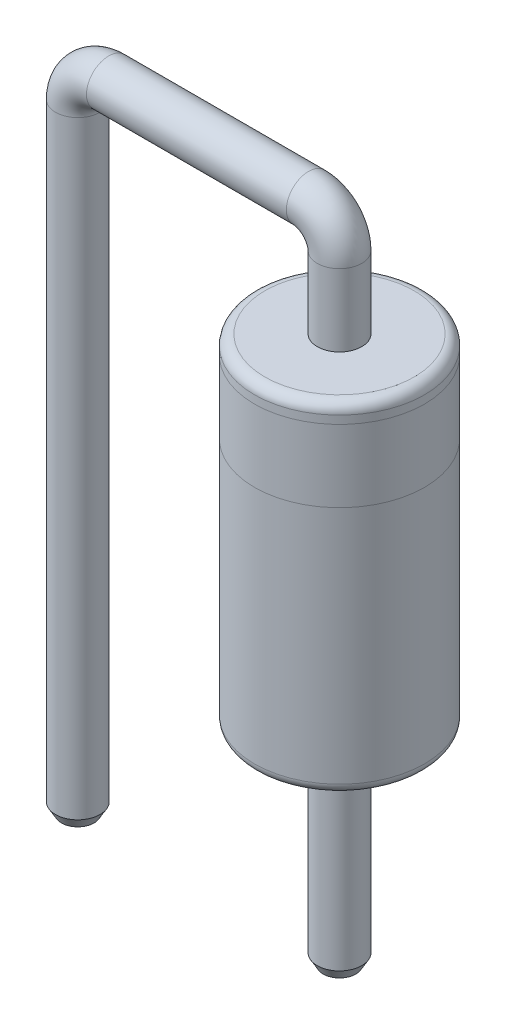
ISO-10303-21;
HEADER;
FILE_DESCRIPTION(('STEP AP214'),'2;1');
FILE_NAME('part.step','',(''),(''),'','','');
FILE_SCHEMA(('AUTOMOTIVE_DESIGN { 1 0 10303 214 1 1 1 1 }'));
ENDSEC;
DATA;
#1=APPLICATION_CONTEXT('core data for automotive mechanical design processes');
#2=APPLICATION_PROTOCOL_DEFINITION('international standard','automotive_design',2000,#1);
#3=PRODUCT_CONTEXT('',#1,'mechanical');
#4=PRODUCT('Part','Part','',(#3));
#5=PRODUCT_RELATED_PRODUCT_CATEGORY('part','',(#4));
#6=PRODUCT_DEFINITION_FORMATION('','',#4);
#7=PRODUCT_DEFINITION_CONTEXT('part definition',#1,'design');
#8=PRODUCT_DEFINITION('design','',#6,#7);
#9=PRODUCT_DEFINITION_SHAPE('','',#8);
#10=(LENGTH_UNIT() NAMED_UNIT(*) SI_UNIT(.MILLI.,.METRE.));
#11=(NAMED_UNIT(*) PLANE_ANGLE_UNIT() SI_UNIT($,.RADIAN.));
#12=(NAMED_UNIT(*) SI_UNIT($,.STERADIAN.) SOLID_ANGLE_UNIT());
#13=UNCERTAINTY_MEASURE_WITH_UNIT(LENGTH_MEASURE(1.E-05),#10,'distance_accuracy_value','');
#14=(GEOMETRIC_REPRESENTATION_CONTEXT(3) GLOBAL_UNCERTAINTY_ASSIGNED_CONTEXT((#13)) GLOBAL_UNIT_ASSIGNED_CONTEXT((#10,
#11,#12)) REPRESENTATION_CONTEXT('',''));
#15=CARTESIAN_POINT('',(0.,0.,0.));
#16=DIRECTION('',(0.,0.,1.));
#17=DIRECTION('',(1.,0.,0.));
#18=AXIS2_PLACEMENT_3D('',#15,#16,#17);
#19=CARTESIAN_POINT('',(0.,5.302,0.));
#20=DIRECTION('',(0.,-1.,0.));
#21=DIRECTION('',(0.,0.,-1.));
#22=AXIS2_PLACEMENT_3D('',#19,#20,#21);
#23=CYLINDRICAL_SURFACE('',#22,0.825);
#24=CARTESIAN_POINT('',(0.,5.202,0.));
#25=DIRECTION('',(0.,1.,0.));
#26=DIRECTION('',(0.,0.,1.));
#27=AXIS2_PLACEMENT_3D('',#24,#25,#26);
#28=CIRCLE('',#27,0.825);
#29=CARTESIAN_POINT('',(0.,5.202,-0.825));
#30=VERTEX_POINT('',#29);
#31=EDGE_CURVE('E67',#30,#30,#28,.F.);
#32=CARTESIAN_POINT('',(0.,5.1241133672325,0.));
#33=DIRECTION('',(0.,-1.,0.));
#34=DIRECTION('',(0.,0.,-1.));
#35=AXIS2_PLACEMENT_3D('',#32,#33,#34);
#36=CIRCLE('',#35,0.825);
#37=CARTESIAN_POINT('',(0.,5.1241133672325,-0.825));
#38=VERTEX_POINT('',#37);
#39=EDGE_CURVE('E10',#38,#38,#36,.T.);
#40=CARTESIAN_POINT('',(0.,5.202,-0.825));
#41=CARTESIAN_POINT('',(0.,5.20118868090867,-0.825));
#42=CARTESIAN_POINT('',(0.,5.20037736181734,-0.825));
#43=CARTESIAN_POINT('',(0.,5.19875472363469,-0.825));
#44=CARTESIAN_POINT('',(0.,5.19794340454336,-0.825));
#45=CARTESIAN_POINT('',(0.,5.1963207663607,-0.825));
#46=CARTESIAN_POINT('',(0.,5.19550944726937,-0.825));
#47=CARTESIAN_POINT('',(0.,5.19388680908672,-0.825));
#48=CARTESIAN_POINT('',(0.,5.19307548999539,-0.825));
#49=CARTESIAN_POINT('',(0.,5.19145285181273,-0.825));
#50=CARTESIAN_POINT('',(0.,5.1906415327214,-0.825));
#51=CARTESIAN_POINT('',(0.,5.18901889453875,-0.825));
#52=CARTESIAN_POINT('',(0.,5.18820757544742,-0.825));
#53=CARTESIAN_POINT('',(0.,5.18658493726476,-0.825));
#54=CARTESIAN_POINT('',(0.,5.18577361817344,-0.825));
#55=CARTESIAN_POINT('',(0.,5.18415097999078,-0.825));
#56=CARTESIAN_POINT('',(0.,5.18333966089945,-0.825));
#57=CARTESIAN_POINT('',(0.,5.1817170227168,-0.825));
#58=CARTESIAN_POINT('',(0.,5.18090570362547,-0.825));
#59=CARTESIAN_POINT('',(0.,5.17928306544281,-0.825));
#60=CARTESIAN_POINT('',(0.,5.17847174635148,-0.825));
#61=CARTESIAN_POINT('',(0.,5.17684910816883,-0.825));
#62=CARTESIAN_POINT('',(0.,5.1760377890775,-0.825));
#63=CARTESIAN_POINT('',(0.,5.17441515089484,-0.825));
#64=CARTESIAN_POINT('',(0.,5.17360383180351,-0.825));
#65=CARTESIAN_POINT('',(0.,5.17198119362086,-0.825));
#66=CARTESIAN_POINT('',(0.,5.17116987452953,-0.825));
#67=CARTESIAN_POINT('',(0.,5.16954723634687,-0.825));
#68=CARTESIAN_POINT('',(0.,5.16873591725554,-0.825));
#69=CARTESIAN_POINT('',(0.,5.16711327907289,-0.825));
#70=CARTESIAN_POINT('',(0.,5.16630195998156,-0.825));
#71=CARTESIAN_POINT('',(0.,5.1646793217989,-0.825));
#72=CARTESIAN_POINT('',(0.,5.16386800270758,-0.825));
#73=CARTESIAN_POINT('',(0.,5.16224536452492,-0.825));
#74=CARTESIAN_POINT('',(0.,5.16143404543359,-0.825));
#75=CARTESIAN_POINT('',(0.,5.15981140725094,-0.825));
#76=CARTESIAN_POINT('',(0.,5.15900008815961,-0.825));
#77=CARTESIAN_POINT('',(0.,5.15737744997695,-0.825));
#78=CARTESIAN_POINT('',(0.,5.15656613088562,-0.825));
#79=CARTESIAN_POINT('',(0.,5.15494349270297,-0.825));
#80=CARTESIAN_POINT('',(0.,5.15413217361164,-0.825));
#81=CARTESIAN_POINT('',(0.,5.15250953542898,-0.825));
#82=CARTESIAN_POINT('',(0.,5.15169821633765,-0.825));
#83=CARTESIAN_POINT('',(0.,5.150075578155,-0.825));
#84=CARTESIAN_POINT('',(0.,5.14926425906367,-0.825));
#85=CARTESIAN_POINT('',(0.,5.14764162088101,-0.825));
#86=CARTESIAN_POINT('',(0.,5.14683030178968,-0.825));
#87=CARTESIAN_POINT('',(0.,5.14520766360703,-0.825));
#88=CARTESIAN_POINT('',(0.,5.1443963445157,-0.825));
#89=CARTESIAN_POINT('',(0.,5.14277370633304,-0.825));
#90=CARTESIAN_POINT('',(0.,5.14196238724172,-0.825));
#91=CARTESIAN_POINT('',(0.,5.14033974905906,-0.825));
#92=CARTESIAN_POINT('',(0.,5.13952842996773,-0.825));
#93=CARTESIAN_POINT('',(0.,5.13790579178507,-0.825));
#94=CARTESIAN_POINT('',(0.,5.13709447269375,-0.825));
#95=CARTESIAN_POINT('',(0.,5.13547183451109,-0.825));
#96=CARTESIAN_POINT('',(0.,5.13466051541976,-0.825));
#97=CARTESIAN_POINT('',(0.,5.13303787723711,-0.825));
#98=CARTESIAN_POINT('',(0.,5.13222655814578,-0.825));
#99=CARTESIAN_POINT('',(0.,5.13060391996312,-0.825));
#100=CARTESIAN_POINT('',(0.,5.12979260087179,-0.825));
#101=CARTESIAN_POINT('',(0.,5.12816996268914,-0.825));
#102=CARTESIAN_POINT('',(0.,5.12735864359781,-0.825));
#103=CARTESIAN_POINT('',(0.,5.12573600541515,-0.825));
#104=CARTESIAN_POINT('',(0.,5.12492468632382,-0.825));
#105=CARTESIAN_POINT('',(0.,5.1241133672325,-0.825));
#106=B_SPLINE_CURVE_WITH_KNOTS('',3,(#40,#41,#42,#43,#44,#45,#46,#47,#48,#49,#50,#51,#52,#53,
#54,#55,#56,#57,#58,#59,#60,#61,#62,#63,#64,#65,#66,#67,#68,#69,#70,#71,#72,#73,#74,#75,#76,#77,
#78,#79,#80,#81,#82,#83,#84,#85,#86,#87,#88,#89,#90,#91,#92,#93,#94,#95,#96,#97,#98,#99,#100,
#101,#102,#103,#104,#105),.UNSPECIFIED.,.F.,.F.,(4,2,2,2,2,2,2,2,2,2,2,2,2,2,2,2,2,2,2,2,2,2,2,
2,2,2,2,2,2,2,2,2,4),(0.,0.00243395727398451,0.00486791454796902,0.00730187182195353,
0.00973582909593804,0.0121697863699225,0.0146037436439071,0.0170377009178916,0.0194716581918761,
0.0219056154658606,0.0243395727398451,0.0267735300138296,0.0292074872878141,0.0316414445617986,
0.0340754018357831,0.0365093591097676,0.0389433163837513,0.0413772736577358,0.0438112309317203,
0.0462451882057048,0.0486791454796893,0.0511131027536738,0.0535470600276583,0.0559810173016428,
0.0584149745756274,0.0608489318496119,0.0632828891235964,0.0657168463975809,0.0681508036715654,
0.0705847609455499,0.0730187182195344,0.0754526754935189,0.0778866327675026),.UNSPECIFIED.);
#107=EDGE_CURVE('BSEAM32',#30,#38,#106,.T.);
#108=ORIENTED_EDGE('',*,*,#31,.T.);
#109=ORIENTED_EDGE('',*,*,#39,.F.);
#110=ORIENTED_EDGE('',*,*,#107,.T.);
#111=ORIENTED_EDGE('',*,*,#107,.F.);
#112=EDGE_LOOP('',(#108,#110,#109,#111));
#113=FACE_BOUND('',#112,.T.);
#114=ADVANCED_FACE('F32',(#113),#23,.T.);
#115=CARTESIAN_POINT('',(0.,2.1,0.));
#116=DIRECTION('',(0.,1.,0.));
#117=DIRECTION('',(0.,0.,1.));
#118=AXIS2_PLACEMENT_3D('',#115,#116,#117);
#119=CIRCLE('',#118,0.825);
#120=CARTESIAN_POINT('',(0.,2.1,-0.825));
#121=VERTEX_POINT('',#120);
#122=EDGE_CURVE('E70',#121,#121,#119,.T.);
#123=CARTESIAN_POINT('',(0.,4.4241133672325,0.));
#124=DIRECTION('',(0.,1.,0.));
#125=DIRECTION('',(0.,0.,1.));
#126=AXIS2_PLACEMENT_3D('',#123,#124,#125);
#127=CIRCLE('',#126,0.825);
#128=CARTESIAN_POINT('',(0.,4.4241133672325,-0.825));
#129=VERTEX_POINT('',#128);
#130=EDGE_CURVE('E40',#129,#129,#127,.T.);
#131=CARTESIAN_POINT('',(0.,2.1,-0.825));
#132=CARTESIAN_POINT('',(0.,2.124209514242,-0.825));
#133=CARTESIAN_POINT('',(0.,2.14841902848401,-0.825));
#134=CARTESIAN_POINT('',(0.,2.19683805696802,-0.825));
#135=CARTESIAN_POINT('',(0.,2.22104757121003,-0.825));
#136=CARTESIAN_POINT('',(0.,2.26946659969404,-0.825));
#137=CARTESIAN_POINT('',(0.,2.29367611393604,-0.825));
#138=CARTESIAN_POINT('',(0.,2.34209514242005,-0.825));
#139=CARTESIAN_POINT('',(0.,2.36630465666206,-0.825));
#140=CARTESIAN_POINT('',(0.,2.41472368514607,-0.825));
#141=CARTESIAN_POINT('',(0.,2.43893319938807,-0.825));
#142=CARTESIAN_POINT('',(0.,2.48735222787208,-0.825));
#143=CARTESIAN_POINT('',(0.,2.51156174211409,-0.825));
#144=CARTESIAN_POINT('',(0.,2.5599807705981,-0.825));
#145=CARTESIAN_POINT('',(0.,2.5841902848401,-0.825));
#146=CARTESIAN_POINT('',(0.,2.63260931332411,-0.825));
#147=CARTESIAN_POINT('',(0.,2.65681882756612,-0.825));
#148=CARTESIAN_POINT('',(0.,2.70523785605013,-0.825));
#149=CARTESIAN_POINT('',(0.,2.72944737029213,-0.825));
#150=CARTESIAN_POINT('',(0.,2.77786639877614,-0.825));
#151=CARTESIAN_POINT('',(0.,2.80207591301815,-0.825));
#152=CARTESIAN_POINT('',(0.,2.85049494150216,-0.825));
#153=CARTESIAN_POINT('',(0.,2.87470445574416,-0.825));
#154=CARTESIAN_POINT('',(0.,2.92312348422818,-0.825));
#155=CARTESIAN_POINT('',(0.,2.94733299847018,-0.825));
#156=CARTESIAN_POINT('',(0.,2.99575202695419,-0.825));
#157=CARTESIAN_POINT('',(0.,3.0199615411962,-0.825));
#158=CARTESIAN_POINT('',(0.,3.06838056968021,-0.825));
#159=CARTESIAN_POINT('',(0.,3.09259008392221,-0.825));
#160=CARTESIAN_POINT('',(0.,3.14100911240622,-0.825));
#161=CARTESIAN_POINT('',(0.,3.16521862664823,-0.825));
#162=CARTESIAN_POINT('',(0.,3.21363765513224,-0.825));
#163=CARTESIAN_POINT('',(0.,3.23784716937424,-0.825));
#164=CARTESIAN_POINT('',(0.,3.28626619785825,-0.825));
#165=CARTESIAN_POINT('',(0.,3.31047571210026,-0.825));
#166=CARTESIAN_POINT('',(0.,3.35889474058427,-0.825));
#167=CARTESIAN_POINT('',(0.,3.38310425482627,-0.825));
#168=CARTESIAN_POINT('',(0.,3.43152328331028,-0.825));
#169=CARTESIAN_POINT('',(0.,3.45573279755229,-0.825));
#170=CARTESIAN_POINT('',(0.,3.5041518260363,-0.825));
#171=CARTESIAN_POINT('',(0.,3.5283613402783,-0.825));
#172=CARTESIAN_POINT('',(0.,3.57678036876231,-0.825));
#173=CARTESIAN_POINT('',(0.,3.60098988300432,-0.825));
#174=CARTESIAN_POINT('',(0.,3.64940891148833,-0.825));
#175=CARTESIAN_POINT('',(0.,3.67361842573034,-0.825));
#176=CARTESIAN_POINT('',(0.,3.72203745421435,-0.825));
#177=CARTESIAN_POINT('',(0.,3.74624696845635,-0.825));
#178=CARTESIAN_POINT('',(0.,3.79466599694036,-0.825));
#179=CARTESIAN_POINT('',(0.,3.81887551118237,-0.825));
#180=CARTESIAN_POINT('',(0.,3.86729453966638,-0.825));
#181=CARTESIAN_POINT('',(0.,3.89150405390838,-0.825));
#182=CARTESIAN_POINT('',(0.,3.93992308239239,-0.825));
#183=CARTESIAN_POINT('',(0.,3.9641325966344,-0.825));
#184=CARTESIAN_POINT('',(0.,4.01255162511841,-0.825));
#185=CARTESIAN_POINT('',(0.,4.03676113936041,-0.825));
#186=CARTESIAN_POINT('',(0.,4.08518016784442,-0.825));
#187=CARTESIAN_POINT('',(0.,4.10938968208643,-0.825));
#188=CARTESIAN_POINT('',(0.,4.15780871057044,-0.825));
#189=CARTESIAN_POINT('',(0.,4.18201822481244,-0.825));
#190=CARTESIAN_POINT('',(0.,4.23043725329645,-0.825));
#191=CARTESIAN_POINT('',(0.,4.25464676753846,-0.825));
#192=CARTESIAN_POINT('',(0.,4.30306579602247,-0.825));
#193=CARTESIAN_POINT('',(0.,4.32727531026447,-0.825));
#194=CARTESIAN_POINT('',(0.,4.37569433874849,-0.825));
#195=CARTESIAN_POINT('',(0.,4.39990385299049,-0.825));
#196=CARTESIAN_POINT('',(0.,4.4241133672325,-0.825));
#197=B_SPLINE_CURVE_WITH_KNOTS('',3,(#131,#132,#133,#134,#135,#136,#137,#138,#139,#140,#141,
#142,#143,#144,#145,#146,#147,#148,#149,#150,#151,#152,#153,#154,#155,#156,#157,#158,#159,#160,
#161,#162,#163,#164,#165,#166,#167,#168,#169,#170,#171,#172,#173,#174,#175,#176,#177,#178,#179,
#180,#181,#182,#183,#184,#185,#186,#187,#188,#189,#190,#191,#192,#193,#194,#195,#196),
.UNSPECIFIED.,.F.,.F.,(4,2,2,2,2,2,2,2,2,2,2,2,2,2,2,2,2,2,2,2,2,2,2,2,2,2,2,2,2,2,2,2,4),(0.,
0.0726285427260155,0.145257085452031,0.217885628178047,0.290514170904062,0.363142713630077,
0.435771256356093,0.508399799082108,0.581028341808124,0.653656884534139,0.726285427260155,
0.79891396998617,0.871542512712186,0.944171055438201,1.01679959816422,1.08942814089023,
1.16205668361625,1.23468522634226,1.30731376906828,1.37994231179429,1.45257085452031,
1.52519939724633,1.59782793997234,1.67045648269836,1.74308502542437,1.81571356815039,
1.8883421108764,1.96097065360242,2.03359919632843,2.10622773905445,2.17885628178046,
2.25148482450648,2.3241133672325),.UNSPECIFIED.);
#198=EDGE_CURVE('BSEAM119',#121,#129,#197,.T.);
#199=ORIENTED_EDGE('',*,*,#122,.T.);
#200=ORIENTED_EDGE('',*,*,#130,.F.);
#201=ORIENTED_EDGE('',*,*,#198,.T.);
#202=ORIENTED_EDGE('',*,*,#198,.F.);
#203=EDGE_LOOP('',(#199,#201,#200,#202));
#204=FACE_BOUND('',#203,.T.);
#205=ADVANCED_FACE('F119',(#204),#23,.T.);
#206=CARTESIAN_POINT('',(-2.54,6.002,0.));
#207=DIRECTION('',(0.,-1.,0.));
#208=DIRECTION('',(1.,0.,0.));
#209=AXIS2_PLACEMENT_3D('',#206,#207,#208);
#210=CYLINDRICAL_SURFACE('',#209,0.2159);
#211=CARTESIAN_POINT('',(-2.54,0.0999999999999977,0.));
#212=DIRECTION('',(0.,-1.,0.));
#213=DIRECTION('',(0.,0.,-1.));
#214=AXIS2_PLACEMENT_3D('',#211,#212,#213);
#215=CIRCLE('',#214,0.2159);
#216=CARTESIAN_POINT('',(-2.54,0.0999999999999977,-0.2159));
#217=VERTEX_POINT('',#216);
#218=EDGE_CURVE('E58',#217,#217,#215,.F.);
#219=ORIENTED_EDGE('',*,*,#218,.T.);
#220=EDGE_LOOP('',(#219));
#221=FACE_BOUND('',#220,.T.);
#222=CARTESIAN_POINT('',(-2.54,6.002,0.));
#223=DIRECTION('',(0.,-1.,0.));
#224=DIRECTION('',(0.,0.,1.));
#225=AXIS2_PLACEMENT_3D('',#222,#223,#224);
#226=CIRCLE('',#225,0.2159);
#227=CARTESIAN_POINT('',(-2.7559,6.002,0.));
#228=VERTEX_POINT('',#227);
#229=EDGE_CURVE('E83',#228,#228,#226,.T.);
#230=ORIENTED_EDGE('',*,*,#229,.T.);
#231=EDGE_LOOP('',(#230));
#232=FACE_BOUND('',#231,.T.);
#233=ADVANCED_FACE('F126',(#221,#232),#210,.T.);
#234=CARTESIAN_POINT('',(-2.24,6.002,0.));
#235=DIRECTION('',(0.,0.,1.));
#236=DIRECTION('',(1.,0.,0.));
#237=AXIS2_PLACEMENT_3D('',#234,#235,#236);
#238=TOROIDAL_SURFACE('',#237,0.299999999999998,0.2159);
#239=CARTESIAN_POINT('',(-2.24,6.302,0.));
#240=DIRECTION('',(-1.,0.,0.));
#241=DIRECTION('',(0.,0.,1.));
#242=AXIS2_PLACEMENT_3D('',#239,#240,#241);
#243=CIRCLE('',#242,0.2159);
#244=CARTESIAN_POINT('',(-2.24,6.5179,0.));
#245=VERTEX_POINT('',#244);
#246=EDGE_CURVE('E86',#245,#245,#243,.T.);
#247=CARTESIAN_POINT('',(-2.24,6.002,0.));
#248=DIRECTION('',(0.,0.,1.));
#249=DIRECTION('',(1.,0.,0.));
#250=AXIS2_PLACEMENT_3D('',#247,#248,#249);
#251=CIRCLE('',#250,0.515899999999998);
#252=EDGE_CURVE('',#245,#228,#251,.T.);
#253=ORIENTED_EDGE('',*,*,#246,.T.);
#254=ORIENTED_EDGE('',*,*,#229,.F.);
#255=ORIENTED_EDGE('',*,*,#252,.T.);
#256=ORIENTED_EDGE('',*,*,#252,.F.);
#257=EDGE_LOOP('',(#253,#255,#254,#256));
#258=FACE_BOUND('',#257,.T.);
#259=ADVANCED_FACE('F165',(#258),#238,.T.);
#260=CARTESIAN_POINT('',(-0.3,6.302,0.));
#261=DIRECTION('',(-1.,0.,0.));
#262=DIRECTION('',(0.,-1.,0.));
#263=AXIS2_PLACEMENT_3D('',#260,#261,#262);
#264=CYLINDRICAL_SURFACE('',#263,0.2159);
#265=CARTESIAN_POINT('',(-0.3,6.302,0.));
#266=DIRECTION('',(-1.,0.,0.));
#267=DIRECTION('',(0.,0.,1.));
#268=AXIS2_PLACEMENT_3D('',#265,#266,#267);
#269=CIRCLE('',#268,0.2159);
#270=CARTESIAN_POINT('',(-0.3,6.5179,0.));
#271=VERTEX_POINT('',#270);
#272=EDGE_CURVE('E89',#271,#271,#269,.T.);
#273=ORIENTED_EDGE('',*,*,#272,.T.);
#274=EDGE_LOOP('',(#273));
#275=FACE_BOUND('',#274,.T.);
#276=ORIENTED_EDGE('',*,*,#246,.F.);
#277=EDGE_LOOP('',(#276));
#278=FACE_BOUND('',#277,.T.);
#279=ADVANCED_FACE('F111',(#275,#278),#264,.T.);
#280=CARTESIAN_POINT('',(-0.3,6.002,0.));
#281=DIRECTION('',(0.,0.,1.));
#282=DIRECTION('',(1.,0.,0.));
#283=AXIS2_PLACEMENT_3D('',#280,#281,#282);
#284=TOROIDAL_SURFACE('',#283,0.3,0.2159);
#285=CARTESIAN_POINT('',(0.,6.002,0.));
#286=DIRECTION('',(0.,1.,0.));
#287=DIRECTION('',(0.,0.,1.));
#288=AXIS2_PLACEMENT_3D('',#285,#286,#287);
#289=CIRCLE('',#288,0.2159);
#290=CARTESIAN_POINT('',(0.2159,6.002,0.));
#291=VERTEX_POINT('',#290);
#292=EDGE_CURVE('E80',#291,#291,#289,.T.);
#293=CARTESIAN_POINT('',(-0.3,6.002,0.));
#294=DIRECTION('',(0.,0.,1.));
#295=DIRECTION('',(1.,0.,0.));
#296=AXIS2_PLACEMENT_3D('',#293,#294,#295);
#297=CIRCLE('',#296,0.5159);
#298=EDGE_CURVE('',#291,#271,#297,.T.);
#299=ORIENTED_EDGE('',*,*,#292,.T.);
#300=ORIENTED_EDGE('',*,*,#272,.F.);
#301=ORIENTED_EDGE('',*,*,#298,.T.);
#302=ORIENTED_EDGE('',*,*,#298,.F.);
#303=EDGE_LOOP('',(#299,#301,#300,#302));
#304=FACE_BOUND('',#303,.T.);
#305=ADVANCED_FACE('F95',(#304),#284,.T.);
#306=CARTESIAN_POINT('',(0.,6.002,0.));
#307=DIRECTION('',(0.,-1.,0.));
#308=DIRECTION('',(1.,0.,0.));
#309=AXIS2_PLACEMENT_3D('',#306,#307,#308);
#310=CYLINDRICAL_SURFACE('',#309,0.2159);
#311=CARTESIAN_POINT('',(0.,5.302,0.));
#312=DIRECTION('',(0.,1.,0.));
#313=DIRECTION('',(0.,0.,1.));
#314=AXIS2_PLACEMENT_3D('',#311,#312,#313);
#315=CIRCLE('',#314,0.2159);
#316=CARTESIAN_POINT('',(0.,5.302,0.2159));
#317=VERTEX_POINT('',#316);
#318=EDGE_CURVE('E77',#317,#317,#315,.T.);
#319=ORIENTED_EDGE('',*,*,#318,.T.);
#320=EDGE_LOOP('',(#319));
#321=FACE_BOUND('',#320,.T.);
#322=ORIENTED_EDGE('',*,*,#292,.F.);
#323=EDGE_LOOP('',(#322));
#324=FACE_BOUND('',#323,.T.);
#325=ADVANCED_FACE('F98',(#321,#324),#310,.T.);
#326=CARTESIAN_POINT('',(-2.54,0.,0.));
#327=DIRECTION('',(0.,-1.,0.));
#328=DIRECTION('',(0.,0.,1.));
#329=AXIS2_PLACEMENT_3D('',#326,#327,#328);
#330=PLANE('',#329);
#331=CARTESIAN_POINT('',(-2.54,0.,0.));
#332=DIRECTION('',(0.,-1.,0.));
#333=DIRECTION('',(1.,0.,0.));
#334=AXIS2_PLACEMENT_3D('',#331,#332,#333);
#335=CIRCLE('',#334,0.158164973081037);
#336=CARTESIAN_POINT('',(-2.38183502691896,0.,0.));
#337=VERTEX_POINT('',#336);
#338=EDGE_CURVE('E61',#337,#337,#335,.T.);
#339=ORIENTED_EDGE('',*,*,#338,.T.);
#340=EDGE_LOOP('',(#339));
#341=FACE_BOUND('',#340,.T.);
#342=ADVANCED_FACE('F100',(#341),#330,.T.);
#343=CARTESIAN_POINT('',(0.,5.302,0.));
#344=DIRECTION('',(0.,1.,0.));
#345=DIRECTION('',(0.,0.,1.));
#346=AXIS2_PLACEMENT_3D('',#343,#344,#345);
#347=PLANE('',#346);
#348=CARTESIAN_POINT('',(0.,5.302,0.));
#349=DIRECTION('',(0.,1.,0.));
#350=DIRECTION('',(0.,0.,1.));
#351=AXIS2_PLACEMENT_3D('',#348,#349,#350);
#352=CIRCLE('',#351,0.725);
#353=CARTESIAN_POINT('',(0.,5.302,0.725));
#354=VERTEX_POINT('',#353);
#355=EDGE_CURVE('E73',#354,#354,#352,.T.);
#356=ORIENTED_EDGE('',*,*,#355,.T.);
#357=EDGE_LOOP('',(#356));
#358=FACE_BOUND('',#357,.T.);
#359=ORIENTED_EDGE('',*,*,#318,.F.);
#360=EDGE_LOOP('',(#359));
#361=FACE_BOUND('',#360,.T.);
#362=ADVANCED_FACE('F108',(#358,#361),#347,.T.);
#363=CARTESIAN_POINT('',(0.,2.,0.));
#364=DIRECTION('',(0.,1.,0.));
#365=DIRECTION('',(0.,0.,1.));
#366=AXIS2_PLACEMENT_3D('',#363,#364,#365);
#367=PLANE('',#366);
#368=CARTESIAN_POINT('',(0.,2.,0.));
#369=DIRECTION('',(0.,1.,0.));
#370=DIRECTION('',(0.,0.,1.));
#371=AXIS2_PLACEMENT_3D('',#368,#369,#370);
#372=CIRCLE('',#371,0.725);
#373=CARTESIAN_POINT('',(0.,2.,0.725));
#374=VERTEX_POINT('',#373);
#375=EDGE_CURVE('E64',#374,#374,#372,.F.);
#376=ORIENTED_EDGE('',*,*,#375,.T.);
#377=EDGE_LOOP('',(#376));
#378=FACE_BOUND('',#377,.T.);
#379=CARTESIAN_POINT('',(0.,2.,0.));
#380=DIRECTION('',(0.,1.,0.));
#381=DIRECTION('',(0.,0.,1.));
#382=AXIS2_PLACEMENT_3D('',#379,#380,#381);
#383=CIRCLE('',#382,0.2159);
#384=CARTESIAN_POINT('',(0.,2.,0.2159));
#385=VERTEX_POINT('',#384);
#386=EDGE_CURVE('E76',#385,#385,#383,.T.);
#387=ORIENTED_EDGE('',*,*,#386,.T.);
#388=EDGE_LOOP('',(#387));
#389=FACE_BOUND('',#388,.T.);
#390=ADVANCED_FACE('F131',(#378,#389),#367,.F.);
#391=CARTESIAN_POINT('',(0.,5.1241133672325,-0.825));
#392=CARTESIAN_POINT('',(0.,5.11682170056583,-0.825));
#393=CARTESIAN_POINT('',(0.,5.10953003389916,-0.825));
#394=CARTESIAN_POINT('',(0.,5.09494670056583,-0.825));
#395=CARTESIAN_POINT('',(0.,5.08765503389916,-0.825));
#396=CARTESIAN_POINT('',(0.,5.07307170056583,-0.825));
#397=CARTESIAN_POINT('',(0.,5.06578003389916,-0.825));
#398=CARTESIAN_POINT('',(0.,5.05119670056583,-0.825));
#399=CARTESIAN_POINT('',(0.,5.04390503389916,-0.825));
#400=CARTESIAN_POINT('',(0.,5.02932170056583,-0.825));
#401=CARTESIAN_POINT('',(0.,5.02203003389916,-0.825));
#402=CARTESIAN_POINT('',(0.,5.00744670056583,-0.825));
#403=CARTESIAN_POINT('',(0.,5.00015503389916,-0.825));
#404=CARTESIAN_POINT('',(0.,4.98557170056583,-0.825));
#405=CARTESIAN_POINT('',(0.,4.97828003389916,-0.825));
#406=CARTESIAN_POINT('',(0.,4.96369670056583,-0.825));
#407=CARTESIAN_POINT('',(0.,4.95640503389916,-0.825));
#408=CARTESIAN_POINT('',(0.,4.94182170056583,-0.825));
#409=CARTESIAN_POINT('',(0.,4.93453003389916,-0.825));
#410=CARTESIAN_POINT('',(0.,4.91994670056583,-0.825));
#411=CARTESIAN_POINT('',(0.,4.91265503389916,-0.825));
#412=CARTESIAN_POINT('',(0.,4.89807170056583,-0.825));
#413=CARTESIAN_POINT('',(0.,4.89078003389916,-0.825));
#414=CARTESIAN_POINT('',(0.,4.87619670056583,-0.825));
#415=CARTESIAN_POINT('',(0.,4.86890503389916,-0.825));
#416=CARTESIAN_POINT('',(0.,4.85432170056583,-0.825));
#417=CARTESIAN_POINT('',(0.,4.84703003389916,-0.825));
#418=CARTESIAN_POINT('',(0.,4.83244670056583,-0.825));
#419=CARTESIAN_POINT('',(0.,4.82515503389916,-0.825));
#420=CARTESIAN_POINT('',(0.,4.81057170056583,-0.825));
#421=CARTESIAN_POINT('',(0.,4.80328003389916,-0.825));
#422=CARTESIAN_POINT('',(0.,4.78869670056583,-0.825));
#423=CARTESIAN_POINT('',(0.,4.78140503389916,-0.825));
#424=CARTESIAN_POINT('',(0.,4.76682170056583,-0.825));
#425=CARTESIAN_POINT('',(0.,4.75953003389916,-0.825));
#426=CARTESIAN_POINT('',(0.,4.74494670056583,-0.825));
#427=CARTESIAN_POINT('',(0.,4.73765503389916,-0.825));
#428=CARTESIAN_POINT('',(0.,4.72307170056583,-0.825));
#429=CARTESIAN_POINT('',(0.,4.71578003389916,-0.825));
#430=CARTESIAN_POINT('',(0.,4.70119670056583,-0.825));
#431=CARTESIAN_POINT('',(0.,4.69390503389916,-0.825));
#432=CARTESIAN_POINT('',(0.,4.67932170056583,-0.825));
#433=CARTESIAN_POINT('',(0.,4.67203003389916,-0.825));
#434=CARTESIAN_POINT('',(0.,4.65744670056583,-0.825));
#435=CARTESIAN_POINT('',(0.,4.65015503389916,-0.825));
#436=CARTESIAN_POINT('',(0.,4.63557170056583,-0.825));
#437=CARTESIAN_POINT('',(0.,4.62828003389916,-0.825));
#438=CARTESIAN_POINT('',(0.,4.61369670056583,-0.825));
#439=CARTESIAN_POINT('',(0.,4.60640503389916,-0.825));
#440=CARTESIAN_POINT('',(0.,4.59182170056583,-0.825));
#441=CARTESIAN_POINT('',(0.,4.58453003389916,-0.825));
#442=CARTESIAN_POINT('',(0.,4.56994670056583,-0.825));
#443=CARTESIAN_POINT('',(0.,4.56265503389916,-0.825));
#444=CARTESIAN_POINT('',(0.,4.54807170056583,-0.825));
#445=CARTESIAN_POINT('',(0.,4.54078003389916,-0.825));
#446=CARTESIAN_POINT('',(0.,4.52619670056583,-0.825));
#447=CARTESIAN_POINT('',(0.,4.51890503389916,-0.825));
#448=CARTESIAN_POINT('',(0.,4.50432170056583,-0.825));
#449=CARTESIAN_POINT('',(0.,4.49703003389916,-0.825));
#450=CARTESIAN_POINT('',(0.,4.48244670056583,-0.825));
#451=CARTESIAN_POINT('',(0.,4.47515503389916,-0.825));
#452=CARTESIAN_POINT('',(0.,4.46057170056583,-0.825));
#453=CARTESIAN_POINT('',(0.,4.45328003389916,-0.825));
#454=CARTESIAN_POINT('',(0.,4.43869670056583,-0.825));
#455=CARTESIAN_POINT('',(0.,4.43140503389916,-0.825));
#456=CARTESIAN_POINT('',(0.,4.4241133672325,-0.825));
#457=B_SPLINE_CURVE_WITH_KNOTS('',3,(#391,#392,#393,#394,#395,#396,#397,#398,#399,#400,#401,
#402,#403,#404,#405,#406,#407,#408,#409,#410,#411,#412,#413,#414,#415,#416,#417,#418,#419,#420,
#421,#422,#423,#424,#425,#426,#427,#428,#429,#430,#431,#432,#433,#434,#435,#436,#437,#438,#439,
#440,#441,#442,#443,#444,#445,#446,#447,#448,#449,#450,#451,#452,#453,#454,#455,#456),
.UNSPECIFIED.,.F.,.F.,(4,2,2,2,2,2,2,2,2,2,2,2,2,2,2,2,2,2,2,2,2,2,2,2,2,2,2,2,2,2,2,2,4),(0.,
0.0218750000000002,0.0437500000000004,0.0656250000000006,0.0875000000000008,0.109375000000001,
0.13125,0.153125,0.175000000000001,0.196875000000001,0.218750000000001,0.240625,
0.262500000000001,0.284375000000001,0.306250000000001,0.328125000000001,0.35,0.371875000000001,
0.393750000000001,0.415625000000001,0.437500000000001,0.459375000000001,0.481250000000001,
0.503125000000001,0.525000000000001,0.546875000000001,0.568750000000001,0.590625000000001,
0.612500000000001,0.634375000000001,0.656250000000001,0.678125000000002,0.700000000000001),.UNSPECIFIED.);
#458=EDGE_CURVE('BSEAM122',#38,#129,#457,.T.);
#459=ORIENTED_EDGE('',*,*,#39,.T.);
#460=ORIENTED_EDGE('',*,*,#130,.T.);
#461=ORIENTED_EDGE('',*,*,#458,.T.);
#462=ORIENTED_EDGE('',*,*,#458,.F.);
#463=EDGE_LOOP('',(#459,#461,#460,#462));
#464=FACE_BOUND('',#463,.T.);
#465=ADVANCED_FACE('F122',(#464),#23,.T.);
#466=CARTESIAN_POINT('',(0.,0.,0.));
#467=DIRECTION('',(0.,1.,0.));
#468=DIRECTION('',(0.,0.,1.));
#469=AXIS2_PLACEMENT_3D('',#466,#467,#468);
#470=PLANE('',#469);
#471=CARTESIAN_POINT('',(0.,0.,0.));
#472=DIRECTION('',(0.,1.,0.));
#473=DIRECTION('',(0.,0.,1.));
#474=AXIS2_PLACEMENT_3D('',#471,#472,#473);
#475=CIRCLE('',#474,0.158164973081039);
#476=CARTESIAN_POINT('',(0.,0.,0.158164973081039));
#477=VERTEX_POINT('',#476);
#478=EDGE_CURVE('E47',#477,#477,#475,.F.);
#479=ORIENTED_EDGE('',*,*,#478,.T.);
#480=EDGE_LOOP('',(#479));
#481=FACE_BOUND('',#480,.T.);
#482=ADVANCED_FACE('F116',(#481),#470,.F.);
#483=CARTESIAN_POINT('',(0.,0.0999999999999951,0.));
#484=DIRECTION('',(0.,1.,0.));
#485=DIRECTION('',(-1.,0.,0.));
#486=AXIS2_PLACEMENT_3D('',#483,#484,#485);
#487=CIRCLE('',#486,0.2159);
#488=CARTESIAN_POINT('',(-0.2159,0.0999999999999951,0.));
#489=VERTEX_POINT('',#488);
#490=EDGE_CURVE('E53',#489,#489,#487,.T.);
#491=ORIENTED_EDGE('',*,*,#490,.T.);
#492=EDGE_LOOP('',(#491));
#493=FACE_BOUND('',#492,.T.);
#494=ORIENTED_EDGE('',*,*,#386,.F.);
#495=EDGE_LOOP('',(#494));
#496=FACE_BOUND('',#495,.T.);
#497=ADVANCED_FACE('F103',(#493,#496),#310,.T.);
#498=CARTESIAN_POINT('',(0.,5.202,0.));
#499=DIRECTION('',(0.,1.,0.));
#500=DIRECTION('',(0.,0.,1.));
#501=AXIS2_PLACEMENT_3D('',#498,#499,#500);
#502=TOROIDAL_SURFACE('',#501,0.725,0.1);
#503=ORIENTED_EDGE('',*,*,#31,.F.);
#504=EDGE_LOOP('',(#503));
#505=FACE_BOUND('',#504,.T.);
#506=ORIENTED_EDGE('',*,*,#355,.F.);
#507=EDGE_LOOP('',(#506));
#508=FACE_BOUND('',#507,.T.);
#509=ADVANCED_FACE('F115',(#505,#508),#502,.T.);
#510=CARTESIAN_POINT('',(0.,2.1,0.));
#511=DIRECTION('',(0.,1.,0.));
#512=DIRECTION('',(0.,0.,1.));
#513=AXIS2_PLACEMENT_3D('',#510,#511,#512);
#514=TOROIDAL_SURFACE('',#513,0.725,0.1);
#515=ORIENTED_EDGE('',*,*,#375,.F.);
#516=EDGE_LOOP('',(#515));
#517=FACE_BOUND('',#516,.T.);
#518=ORIENTED_EDGE('',*,*,#122,.F.);
#519=EDGE_LOOP('',(#518));
#520=FACE_BOUND('',#519,.T.);
#521=ADVANCED_FACE('F148',(#517,#520),#514,.T.);
#522=CARTESIAN_POINT('',(-2.54,0.,0.));
#523=DIRECTION('',(0.,1.,0.));
#524=DIRECTION('',(0.,0.,1.));
#525=AXIS2_PLACEMENT_3D('',#522,#523,#524);
#526=CONICAL_SURFACE('',#525,0.158164973081037,0.523598775598304);
#527=ORIENTED_EDGE('',*,*,#218,.F.);
#528=EDGE_LOOP('',(#527));
#529=FACE_BOUND('',#528,.T.);
#530=ORIENTED_EDGE('',*,*,#338,.F.);
#531=EDGE_LOOP('',(#530));
#532=FACE_BOUND('',#531,.T.);
#533=ADVANCED_FACE('F151',(#529,#532),#526,.T.);
#534=CARTESIAN_POINT('',(0.,0.0999999999999951,0.));
#535=DIRECTION('',(0.,1.,0.));
#536=DIRECTION('',(-1.,0.,0.));
#537=AXIS2_PLACEMENT_3D('',#534,#535,#536);
#538=CONICAL_SURFACE('',#537,0.2159,0.523598775598306);
#539=ORIENTED_EDGE('',*,*,#478,.F.);
#540=EDGE_LOOP('',(#539));
#541=FACE_BOUND('',#540,.T.);
#542=ORIENTED_EDGE('',*,*,#490,.F.);
#543=EDGE_LOOP('',(#542));
#544=FACE_BOUND('',#543,.T.);
#545=ADVANCED_FACE('F34',(#541,#544),#538,.T.);
#546=CLOSED_SHELL('',(#114,#205,#233,#259,#279,#305,#325,#342,#362,#390,#465,#482,#497,#509,
#521,#533,#545));
#547=MANIFOLD_SOLID_BREP('B2',#546);
#548=ADVANCED_BREP_SHAPE_REPRESENTATION('',(#18,#547),#14);
#549=SHAPE_DEFINITION_REPRESENTATION(#9,#548);
ENDSEC;
END-ISO-10303-21;
